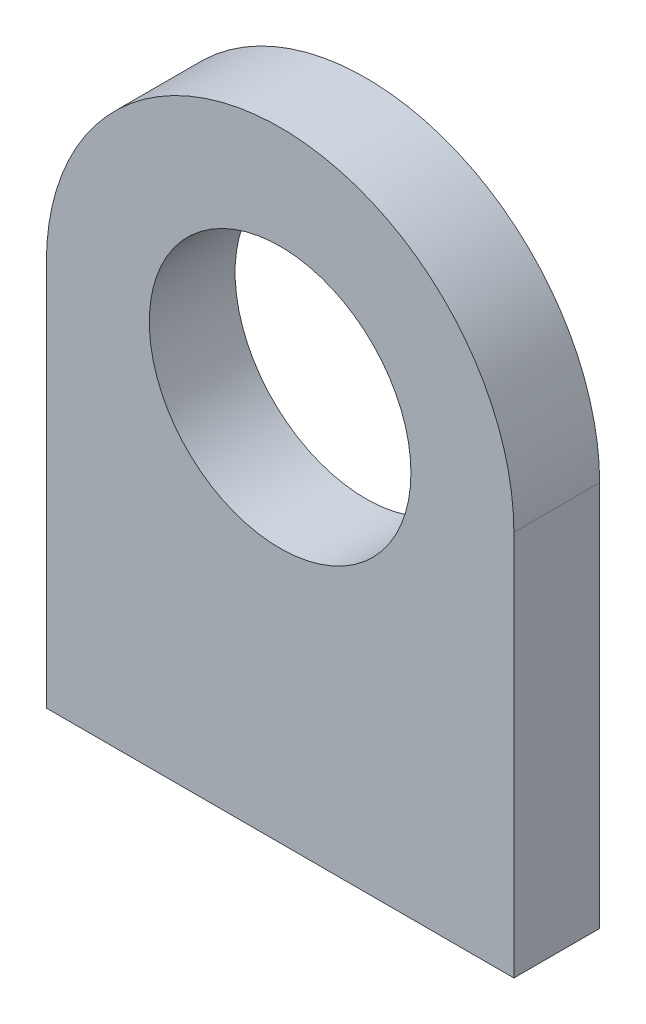
ISO-10303-21;
HEADER;
FILE_DESCRIPTION(('STEP AP214'),'2;1');
FILE_NAME('part.step','',(''),(''),'','','');
FILE_SCHEMA(('AUTOMOTIVE_DESIGN { 1 0 10303 214 1 1 1 1 }'));
ENDSEC;
DATA;
#1=APPLICATION_CONTEXT('core data for automotive mechanical design processes');
#2=APPLICATION_PROTOCOL_DEFINITION('international standard','automotive_design',2000,#1);
#3=PRODUCT_CONTEXT('',#1,'mechanical');
#4=PRODUCT('Part','Part','',(#3));
#5=PRODUCT_RELATED_PRODUCT_CATEGORY('part','',(#4));
#6=PRODUCT_DEFINITION_FORMATION('','',#4);
#7=PRODUCT_DEFINITION_CONTEXT('part definition',#1,'design');
#8=PRODUCT_DEFINITION('design','',#6,#7);
#9=PRODUCT_DEFINITION_SHAPE('','',#8);
#10=(LENGTH_UNIT() NAMED_UNIT(*) SI_UNIT(.MILLI.,.METRE.));
#11=(NAMED_UNIT(*) PLANE_ANGLE_UNIT() SI_UNIT($,.RADIAN.));
#12=(NAMED_UNIT(*) SI_UNIT($,.STERADIAN.) SOLID_ANGLE_UNIT());
#13=UNCERTAINTY_MEASURE_WITH_UNIT(LENGTH_MEASURE(1.E-05),#10,'distance_accuracy_value','');
#14=(GEOMETRIC_REPRESENTATION_CONTEXT(3) GLOBAL_UNCERTAINTY_ASSIGNED_CONTEXT((#13)) GLOBAL_UNIT_ASSIGNED_CONTEXT((#10,
#11,#12)) REPRESENTATION_CONTEXT('',''));
#15=CARTESIAN_POINT('',(0.,0.,0.));
#16=DIRECTION('',(0.,0.,1.));
#17=DIRECTION('',(1.,0.,0.));
#18=AXIS2_PLACEMENT_3D('',#15,#16,#17);
#19=CARTESIAN_POINT('',(0.,20.3339891731331,4.));
#20=DIRECTION('',(0.,0.,1.));
#21=DIRECTION('',(1.,0.,0.));
#22=AXIS2_PLACEMENT_3D('',#19,#20,#21);
#23=PLANE('',#22);
#24=CARTESIAN_POINT('',(0.,20.3339891731331,4.));
#25=DIRECTION('',(0.,0.,1.));
#26=DIRECTION('',(1.,0.,0.));
#27=AXIS2_PLACEMENT_3D('',#24,#25,#26);
#28=CIRCLE('',#27,10.9);
#29=CARTESIAN_POINT('',(10.9,20.3339891731331,4.));
#30=VERTEX_POINT('',#29);
#31=CARTESIAN_POINT('',(-10.9,20.3339891731331,4.));
#32=VERTEX_POINT('',#31);
#33=EDGE_CURVE('E85',#30,#32,#28,.T.);
#34=ORIENTED_EDGE('',*,*,#33,.T.);
#35=DIRECTION('',(0.,-1.,0.));
#36=VECTOR('',#35,1.);
#37=CARTESIAN_POINT('',(-10.9,20.3339891731331,4.));
#38=LINE('',#37,#36);
#39=CARTESIAN_POINT('',(-10.9,2.33398917313308,4.));
#40=VERTEX_POINT('',#39);
#41=EDGE_CURVE('E80',#32,#40,#38,.T.);
#42=ORIENTED_EDGE('',*,*,#41,.T.);
#43=DIRECTION('',(1.,0.,0.));
#44=VECTOR('',#43,1.);
#45=CARTESIAN_POINT('',(-10.9,2.33398917313308,4.));
#46=LINE('',#45,#44);
#47=CARTESIAN_POINT('',(10.9,2.33398917313308,4.));
#48=VERTEX_POINT('',#47);
#49=EDGE_CURVE('E83',#40,#48,#46,.T.);
#50=ORIENTED_EDGE('',*,*,#49,.T.);
#51=DIRECTION('',(0.,1.,0.));
#52=VECTOR('',#51,1.);
#53=CARTESIAN_POINT('',(10.9,20.3339891731331,4.));
#54=LINE('',#53,#52);
#55=EDGE_CURVE('E51',#48,#30,#54,.T.);
#56=ORIENTED_EDGE('',*,*,#55,.T.);
#57=EDGE_LOOP('',(#34,#42,#50,#56));
#58=FACE_BOUND('',#57,.T.);
#59=CARTESIAN_POINT('',(0.,20.3339891731331,4.));
#60=DIRECTION('',(0.,0.,1.));
#61=DIRECTION('',(1.,0.,0.));
#62=AXIS2_PLACEMENT_3D('',#59,#60,#61);
#63=CIRCLE('',#62,6.1);
#64=CARTESIAN_POINT('',(6.1,20.3339891731331,4.));
#65=VERTEX_POINT('',#64);
#66=EDGE_CURVE('E101',#65,#65,#63,.T.);
#67=ORIENTED_EDGE('',*,*,#66,.F.);
#68=EDGE_LOOP('',(#67));
#69=FACE_BOUND('',#68,.T.);
#70=ADVANCED_FACE('F34',(#58,#69),#23,.T.);
#71=CARTESIAN_POINT('',(0.,20.3339891731331,0.));
#72=DIRECTION('',(0.,0.,1.));
#73=DIRECTION('',(1.,0.,0.));
#74=AXIS2_PLACEMENT_3D('',#71,#72,#73);
#75=PLANE('',#74);
#76=CARTESIAN_POINT('',(0.,20.3339891731331,0.));
#77=DIRECTION('',(0.,0.,1.));
#78=DIRECTION('',(1.,0.,0.));
#79=AXIS2_PLACEMENT_3D('',#76,#77,#78);
#80=CIRCLE('',#79,10.9);
#81=CARTESIAN_POINT('',(10.9,20.3339891731331,0.));
#82=VERTEX_POINT('',#81);
#83=CARTESIAN_POINT('',(-10.9,20.3339891731331,0.));
#84=VERTEX_POINT('',#83);
#85=EDGE_CURVE('E98',#82,#84,#80,.T.);
#86=ORIENTED_EDGE('',*,*,#85,.F.);
#87=DIRECTION('',(0.,1.,0.));
#88=VECTOR('',#87,1.);
#89=CARTESIAN_POINT('',(10.9,20.3339891731331,0.));
#90=LINE('',#89,#88);
#91=CARTESIAN_POINT('',(10.9,2.33398917313308,0.));
#92=VERTEX_POINT('',#91);
#93=EDGE_CURVE('E73',#92,#82,#90,.T.);
#94=ORIENTED_EDGE('',*,*,#93,.F.);
#95=DIRECTION('',(1.,0.,0.));
#96=VECTOR('',#95,1.);
#97=CARTESIAN_POINT('',(8.65,2.33398917313308,0.));
#98=LINE('',#97,#96);
#99=CARTESIAN_POINT('',(-10.9,2.33398917313308,0.));
#100=VERTEX_POINT('',#99);
#101=EDGE_CURVE('E67',#100,#92,#98,.T.);
#102=ORIENTED_EDGE('',*,*,#101,.F.);
#103=DIRECTION('',(0.,-1.,0.));
#104=VECTOR('',#103,1.);
#105=CARTESIAN_POINT('',(-10.9,20.3339891731331,0.));
#106=LINE('',#105,#104);
#107=EDGE_CURVE('E90',#84,#100,#106,.T.);
#108=ORIENTED_EDGE('',*,*,#107,.F.);
#109=EDGE_LOOP('',(#86,#94,#102,#108));
#110=FACE_BOUND('',#109,.T.);
#111=CARTESIAN_POINT('',(0.,20.3339891731331,0.));
#112=DIRECTION('',(0.,0.,1.));
#113=DIRECTION('',(1.,0.,0.));
#114=AXIS2_PLACEMENT_3D('',#111,#112,#113);
#115=CIRCLE('',#114,6.1);
#116=CARTESIAN_POINT('',(6.1,20.3339891731331,0.));
#117=VERTEX_POINT('',#116);
#118=EDGE_CURVE('E113',#117,#117,#115,.T.);
#119=ORIENTED_EDGE('',*,*,#118,.T.);
#120=EDGE_LOOP('',(#119));
#121=FACE_BOUND('',#120,.T.);
#122=ADVANCED_FACE('F109',(#110,#121),#75,.F.);
#123=CARTESIAN_POINT('',(0.,20.3339891731331,4.));
#124=DIRECTION('',(0.,0.,-1.));
#125=DIRECTION('',(-1.,0.,0.));
#126=AXIS2_PLACEMENT_3D('',#123,#124,#125);
#127=CYLINDRICAL_SURFACE('',#126,10.9);
#128=ORIENTED_EDGE('',*,*,#85,.T.);
#129=DIRECTION('',(0.,0.,-1.));
#130=VECTOR('',#129,1.);
#131=CARTESIAN_POINT('',(-10.9,20.3339891731331,4.));
#132=LINE('',#131,#130);
#133=EDGE_CURVE('E11',#32,#84,#132,.T.);
#134=ORIENTED_EDGE('',*,*,#133,.F.);
#135=ORIENTED_EDGE('',*,*,#33,.F.);
#136=DIRECTION('',(0.,0.,-1.));
#137=VECTOR('',#136,1.);
#138=CARTESIAN_POINT('',(10.9,20.3339891731331,4.));
#139=LINE('',#138,#137);
#140=EDGE_CURVE('E94',#30,#82,#139,.T.);
#141=ORIENTED_EDGE('',*,*,#140,.T.);
#142=EDGE_LOOP('',(#128,#134,#135,#141));
#143=FACE_BOUND('',#142,.T.);
#144=ADVANCED_FACE('F36',(#143),#127,.T.);
#145=CARTESIAN_POINT('',(-10.9,20.3339891731331,4.));
#146=DIRECTION('',(1.,0.,0.));
#147=DIRECTION('',(0.,0.,-1.));
#148=AXIS2_PLACEMENT_3D('',#145,#146,#147);
#149=PLANE('',#148);
#150=ORIENTED_EDGE('',*,*,#107,.T.);
#151=DIRECTION('',(0.,0.,-1.));
#152=VECTOR('',#151,1.);
#153=CARTESIAN_POINT('',(-10.9,2.33398917313308,4.));
#154=LINE('',#153,#152);
#155=EDGE_CURVE('E43',#40,#100,#154,.T.);
#156=ORIENTED_EDGE('',*,*,#155,.F.);
#157=ORIENTED_EDGE('',*,*,#41,.F.);
#158=ORIENTED_EDGE('',*,*,#133,.T.);
#159=EDGE_LOOP('',(#150,#156,#157,#158));
#160=FACE_BOUND('',#159,.T.);
#161=ADVANCED_FACE('F89',(#160),#149,.F.);
#162=CARTESIAN_POINT('',(8.65,2.33398917313308,4.));
#163=DIRECTION('',(0.,1.,0.));
#164=DIRECTION('',(0.,0.,1.));
#165=AXIS2_PLACEMENT_3D('',#162,#163,#164);
#166=PLANE('',#165);
#167=ORIENTED_EDGE('',*,*,#101,.T.);
#168=DIRECTION('',(0.,0.,-1.));
#169=VECTOR('',#168,1.);
#170=CARTESIAN_POINT('',(10.9,2.33398917313308,4.));
#171=LINE('',#170,#169);
#172=EDGE_CURVE('E91',#48,#92,#171,.T.);
#173=ORIENTED_EDGE('',*,*,#172,.F.);
#174=ORIENTED_EDGE('',*,*,#49,.F.);
#175=ORIENTED_EDGE('',*,*,#155,.T.);
#176=EDGE_LOOP('',(#167,#173,#174,#175));
#177=FACE_BOUND('',#176,.T.);
#178=ADVANCED_FACE('F92',(#177),#166,.F.);
#179=CARTESIAN_POINT('',(10.9,20.3339891731331,4.));
#180=DIRECTION('',(-1.,0.,0.));
#181=DIRECTION('',(0.,-1.,0.));
#182=AXIS2_PLACEMENT_3D('',#179,#180,#181);
#183=PLANE('',#182);
#184=ORIENTED_EDGE('',*,*,#93,.T.);
#185=ORIENTED_EDGE('',*,*,#140,.F.);
#186=ORIENTED_EDGE('',*,*,#55,.F.);
#187=ORIENTED_EDGE('',*,*,#172,.T.);
#188=EDGE_LOOP('',(#184,#185,#186,#187));
#189=FACE_BOUND('',#188,.T.);
#190=ADVANCED_FACE('F106',(#189),#183,.F.);
#191=CARTESIAN_POINT('',(0.,20.3339891731331,4.));
#192=DIRECTION('',(0.,0.,-1.));
#193=DIRECTION('',(-1.,0.,0.));
#194=AXIS2_PLACEMENT_3D('',#191,#192,#193);
#195=CYLINDRICAL_SURFACE('',#194,6.1);
#196=ORIENTED_EDGE('',*,*,#66,.T.);
#197=EDGE_LOOP('',(#196));
#198=FACE_BOUND('',#197,.T.);
#199=ORIENTED_EDGE('',*,*,#118,.F.);
#200=EDGE_LOOP('',(#199));
#201=FACE_BOUND('',#200,.T.);
#202=ADVANCED_FACE('F119',(#198,#201),#195,.F.);
#203=CLOSED_SHELL('',(#70,#122,#144,#161,#178,#190,#202));
#204=MANIFOLD_SOLID_BREP('B2',#203);
#205=ADVANCED_BREP_SHAPE_REPRESENTATION('',(#18,#204),#14);
#206=SHAPE_DEFINITION_REPRESENTATION(#9,#205);
ENDSEC;
END-ISO-10303-21;
